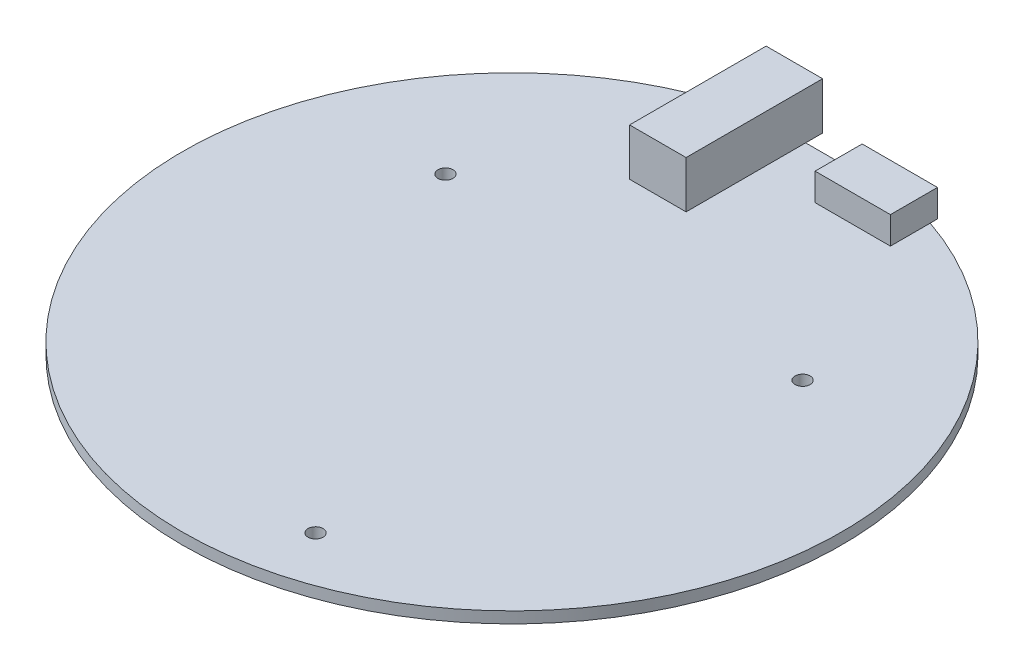
ISO-10303-21;
HEADER;
FILE_DESCRIPTION(('STEP AP214'),'2;1');
FILE_NAME('part.step','',(''),(''),'','','');
FILE_SCHEMA(('AUTOMOTIVE_DESIGN { 1 0 10303 214 1 1 1 1 }'));
ENDSEC;
DATA;
#1=APPLICATION_CONTEXT('core data for automotive mechanical design processes');
#2=APPLICATION_PROTOCOL_DEFINITION('international standard','automotive_design',2000,#1);
#3=PRODUCT_CONTEXT('',#1,'mechanical');
#4=PRODUCT('Part','Part','',(#3));
#5=PRODUCT_RELATED_PRODUCT_CATEGORY('part','',(#4));
#6=PRODUCT_DEFINITION_FORMATION('','',#4);
#7=PRODUCT_DEFINITION_CONTEXT('part definition',#1,'design');
#8=PRODUCT_DEFINITION('design','',#6,#7);
#9=PRODUCT_DEFINITION_SHAPE('','',#8);
#10=(LENGTH_UNIT() NAMED_UNIT(*) SI_UNIT(.MILLI.,.METRE.));
#11=(NAMED_UNIT(*) PLANE_ANGLE_UNIT() SI_UNIT($,.RADIAN.));
#12=(NAMED_UNIT(*) SI_UNIT($,.STERADIAN.) SOLID_ANGLE_UNIT());
#13=UNCERTAINTY_MEASURE_WITH_UNIT(LENGTH_MEASURE(1.E-05),#10,'distance_accuracy_value','');
#14=(GEOMETRIC_REPRESENTATION_CONTEXT(3) GLOBAL_UNCERTAINTY_ASSIGNED_CONTEXT((#13)) GLOBAL_UNIT_ASSIGNED_CONTEXT((#10,
#11,#12)) REPRESENTATION_CONTEXT('',''));
#15=CARTESIAN_POINT('',(0.,0.,0.));
#16=DIRECTION('',(0.,0.,1.));
#17=DIRECTION('',(1.,0.,0.));
#18=AXIS2_PLACEMENT_3D('',#15,#16,#17);
#19=CARTESIAN_POINT('',(0.,0.,0.));
#20=DIRECTION('',(0.,-1.,0.));
#21=DIRECTION('',(0.,0.,-1.));
#22=AXIS2_PLACEMENT_3D('',#19,#20,#21);
#23=PLANE('',#22);
#24=DIRECTION('',(1.,0.,0.));
#25=VECTOR('',#24,1.);
#26=CARTESIAN_POINT('',(0.,0.,-33.9));
#27=LINE('',#26,#25);
#28=CARTESIAN_POINT('',(-8.70574522944479,0.,-33.9));
#29=VERTEX_POINT('',#28);
#30=CARTESIAN_POINT('',(-2.7057452294448,0.,-33.9));
#31=VERTEX_POINT('',#30);
#32=EDGE_CURVE('E59',#29,#31,#27,.T.);
#33=ORIENTED_EDGE('',*,*,#32,.F.);
#34=DIRECTION('',(0.,0.,1.));
#35=VECTOR('',#34,1.);
#36=CARTESIAN_POINT('',(-8.70574522944479,0.,-33.9));
#37=LINE('',#36,#35);
#38=CARTESIAN_POINT('',(-8.70574522944479,0.,-35.7));
#39=VERTEX_POINT('',#38);
#40=EDGE_CURVE('E198',#39,#29,#37,.T.);
#41=ORIENTED_EDGE('',*,*,#40,.F.);
#42=DIRECTION('',(1.,0.,0.));
#43=VECTOR('',#42,1.);
#44=CARTESIAN_POINT('',(-8.70574522944479,0.,-35.7));
#45=LINE('',#44,#43);
#46=CARTESIAN_POINT('',(-2.7057452294448,0.,-35.7));
#47=VERTEX_POINT('',#46);
#48=EDGE_CURVE('E191',#39,#47,#45,.T.);
#49=ORIENTED_EDGE('',*,*,#48,.T.);
#50=DIRECTION('',(0.,0.,1.));
#51=VECTOR('',#50,1.);
#52=CARTESIAN_POINT('',(-2.7057452294448,0.,-33.9));
#53=LINE('',#52,#51);
#54=EDGE_CURVE('E210',#47,#31,#53,.T.);
#55=ORIENTED_EDGE('',*,*,#54,.T.);
#56=EDGE_LOOP('',(#33,#41,#49,#55));
#57=FACE_BOUND('',#56,.T.);
#58=ADVANCED_FACE('F36',(#57),#23,.T.);
#59=CARTESIAN_POINT('',(-8.70574522944479,5.,-33.9));
#60=DIRECTION('',(1.,0.,0.));
#61=DIRECTION('',(0.,0.,-1.));
#62=AXIS2_PLACEMENT_3D('',#59,#60,#61);
#63=PLANE('',#62);
#64=ORIENTED_EDGE('',*,*,#40,.T.);
#65=CARTESIAN_POINT('',(-8.70574522944479,0.,-21.2));
#66=VERTEX_POINT('',#65);
#67=EDGE_CURVE('E215',#29,#66,#37,.T.);
#68=ORIENTED_EDGE('',*,*,#67,.T.);
#69=DIRECTION('',(0.,-1.,0.));
#70=VECTOR('',#69,1.);
#71=CARTESIAN_POINT('',(-8.70574522944479,5.,-21.2));
#72=LINE('',#71,#70);
#73=CARTESIAN_POINT('',(-8.70574522944479,5.,-21.2));
#74=VERTEX_POINT('',#73);
#75=EDGE_CURVE('E44',#74,#66,#72,.T.);
#76=ORIENTED_EDGE('',*,*,#75,.F.);
#77=DIRECTION('',(0.,0.,-1.));
#78=VECTOR('',#77,1.);
#79=CARTESIAN_POINT('',(-8.70574522944479,5.,-33.9));
#80=LINE('',#79,#78);
#81=CARTESIAN_POINT('',(-8.70574522944479,5.,-35.7));
#82=VERTEX_POINT('',#81);
#83=EDGE_CURVE('E194',#74,#82,#80,.T.);
#84=ORIENTED_EDGE('',*,*,#83,.T.);
#85=DIRECTION('',(0.,-1.,0.));
#86=VECTOR('',#85,1.);
#87=CARTESIAN_POINT('',(-8.70574522944479,5.,-35.7));
#88=LINE('',#87,#86);
#89=EDGE_CURVE('E206',#82,#39,#88,.T.);
#90=ORIENTED_EDGE('',*,*,#89,.T.);
#91=EDGE_LOOP('',(#64,#68,#76,#84,#90));
#92=FACE_BOUND('',#91,.T.);
#93=ADVANCED_FACE('F226',(#92),#63,.F.);
#94=CARTESIAN_POINT('',(-8.70574522944479,5.,-21.2));
#95=DIRECTION('',(0.,0.,-1.));
#96=DIRECTION('',(-1.,0.,0.));
#97=AXIS2_PLACEMENT_3D('',#94,#95,#96);
#98=PLANE('',#97);
#99=DIRECTION('',(1.,0.,0.));
#100=VECTOR('',#99,1.);
#101=CARTESIAN_POINT('',(-8.70574522944479,0.,-21.2));
#102=LINE('',#101,#100);
#103=CARTESIAN_POINT('',(-2.7057452294448,0.,-21.2));
#104=VERTEX_POINT('',#103);
#105=EDGE_CURVE('E212',#66,#104,#102,.T.);
#106=ORIENTED_EDGE('',*,*,#105,.T.);
#107=DIRECTION('',(0.,-1.,0.));
#108=VECTOR('',#107,1.);
#109=CARTESIAN_POINT('',(-2.7057452294448,5.,-21.2));
#110=LINE('',#109,#108);
#111=CARTESIAN_POINT('',(-2.7057452294448,5.,-21.2));
#112=VERTEX_POINT('',#111);
#113=EDGE_CURVE('E219',#112,#104,#110,.T.);
#114=ORIENTED_EDGE('',*,*,#113,.F.);
#115=DIRECTION('',(1.,0.,0.));
#116=VECTOR('',#115,1.);
#117=CARTESIAN_POINT('',(-8.70574522944479,5.,-21.2));
#118=LINE('',#117,#116);
#119=EDGE_CURVE('E203',#74,#112,#118,.T.);
#120=ORIENTED_EDGE('',*,*,#119,.F.);
#121=ORIENTED_EDGE('',*,*,#75,.T.);
#122=EDGE_LOOP('',(#106,#114,#120,#121));
#123=FACE_BOUND('',#122,.T.);
#124=ADVANCED_FACE('F253',(#123),#98,.F.);
#125=CARTESIAN_POINT('',(-2.7057452294448,5.,-33.9));
#126=DIRECTION('',(1.,0.,0.));
#127=DIRECTION('',(0.,0.,-1.));
#128=AXIS2_PLACEMENT_3D('',#125,#126,#127);
#129=PLANE('',#128);
#130=ORIENTED_EDGE('',*,*,#54,.F.);
#131=DIRECTION('',(0.,-1.,0.));
#132=VECTOR('',#131,1.);
#133=CARTESIAN_POINT('',(-2.7057452294448,5.,-35.7));
#134=LINE('',#133,#132);
#135=CARTESIAN_POINT('',(-2.7057452294448,5.,-35.7));
#136=VERTEX_POINT('',#135);
#137=EDGE_CURVE('E221',#136,#47,#134,.T.);
#138=ORIENTED_EDGE('',*,*,#137,.F.);
#139=DIRECTION('',(0.,0.,1.));
#140=VECTOR('',#139,1.);
#141=CARTESIAN_POINT('',(-2.7057452294448,5.,-35.7));
#142=LINE('',#141,#140);
#143=EDGE_CURVE('E201',#136,#112,#142,.T.);
#144=ORIENTED_EDGE('',*,*,#143,.T.);
#145=ORIENTED_EDGE('',*,*,#113,.T.);
#146=EDGE_CURVE('E209',#31,#104,#53,.T.);
#147=ORIENTED_EDGE('',*,*,#146,.F.);
#148=EDGE_LOOP('',(#130,#138,#144,#145,#147));
#149=FACE_BOUND('',#148,.T.);
#150=ADVANCED_FACE('F235',(#149),#129,.T.);
#151=CARTESIAN_POINT('',(-8.70574522944479,5.,-35.7));
#152=DIRECTION('',(0.,0.,-1.));
#153=DIRECTION('',(-1.,0.,0.));
#154=AXIS2_PLACEMENT_3D('',#151,#152,#153);
#155=PLANE('',#154);
#156=ORIENTED_EDGE('',*,*,#48,.F.);
#157=ORIENTED_EDGE('',*,*,#89,.F.);
#158=DIRECTION('',(1.,0.,0.));
#159=VECTOR('',#158,1.);
#160=CARTESIAN_POINT('',(-8.70574522944479,5.,-35.7));
#161=LINE('',#160,#159);
#162=EDGE_CURVE('E197',#82,#136,#161,.T.);
#163=ORIENTED_EDGE('',*,*,#162,.T.);
#164=ORIENTED_EDGE('',*,*,#137,.T.);
#165=EDGE_LOOP('',(#156,#157,#163,#164));
#166=FACE_BOUND('',#165,.T.);
#167=ADVANCED_FACE('F38',(#166),#155,.T.);
#168=CARTESIAN_POINT('',(0.,5.,0.));
#169=DIRECTION('',(0.,-1.,0.));
#170=DIRECTION('',(0.,0.,-1.));
#171=AXIS2_PLACEMENT_3D('',#168,#169,#170);
#172=PLANE('',#171);
#173=ORIENTED_EDGE('',*,*,#83,.F.);
#174=ORIENTED_EDGE('',*,*,#119,.T.);
#175=ORIENTED_EDGE('',*,*,#143,.F.);
#176=ORIENTED_EDGE('',*,*,#162,.F.);
#177=EDGE_LOOP('',(#173,#174,#175,#176));
#178=FACE_BOUND('',#177,.T.);
#179=ADVANCED_FACE('F256',(#178),#172,.F.);
#180=CARTESIAN_POINT('',(0.,-1.2,-33.9));
#181=DIRECTION('',(0.,0.,1.));
#182=DIRECTION('',(1.,0.,0.));
#183=AXIS2_PLACEMENT_3D('',#180,#181,#182);
#184=PLANE('',#183);
#185=ORIENTED_EDGE('',*,*,#32,.T.);
#186=CARTESIAN_POINT('',(3.2942547705552,0.,-33.9));
#187=VERTEX_POINT('',#186);
#188=EDGE_CURVE('E177',#31,#187,#27,.T.);
#189=ORIENTED_EDGE('',*,*,#188,.T.);
#190=DIRECTION('',(0.,-1.,0.));
#191=VECTOR('',#190,1.);
#192=CARTESIAN_POINT('',(3.2942547705552,2.9,-33.9));
#193=LINE('',#192,#191);
#194=CARTESIAN_POINT('',(3.2942547705552,2.9,-33.9));
#195=VERTEX_POINT('',#194);
#196=EDGE_CURVE('E131',#195,#187,#193,.T.);
#197=ORIENTED_EDGE('',*,*,#196,.F.);
#198=DIRECTION('',(1.,0.,0.));
#199=VECTOR('',#198,1.);
#200=CARTESIAN_POINT('',(0.,2.9,-33.9));
#201=LINE('',#200,#199);
#202=CARTESIAN_POINT('',(11.2942547705552,2.9,-33.9));
#203=VERTEX_POINT('',#202);
#204=EDGE_CURVE('E136',#195,#203,#201,.T.);
#205=ORIENTED_EDGE('',*,*,#204,.T.);
#206=DIRECTION('',(0.,-1.,0.));
#207=VECTOR('',#206,1.);
#208=CARTESIAN_POINT('',(11.2942547705552,2.9,-33.9));
#209=LINE('',#208,#207);
#210=CARTESIAN_POINT('',(11.2942547705552,0.,-33.9));
#211=VERTEX_POINT('',#210);
#212=EDGE_CURVE('E121',#203,#211,#209,.T.);
#213=ORIENTED_EDGE('',*,*,#212,.T.);
#214=DIRECTION('',(1.,0.,0.));
#215=VECTOR('',#214,1.);
#216=CARTESIAN_POINT('',(0.,0.,-33.9));
#217=LINE('',#216,#215);
#218=CARTESIAN_POINT('',(8.70574522944479,0.,-33.9));
#219=VERTEX_POINT('',#218);
#220=EDGE_CURVE('E151',#219,#211,#217,.T.);
#221=ORIENTED_EDGE('',*,*,#220,.F.);
#222=DIRECTION('',(0.,1.,0.));
#223=VECTOR('',#222,1.);
#224=CARTESIAN_POINT('',(8.70574522944479,-1.2,-33.9));
#225=LINE('',#224,#223);
#226=CARTESIAN_POINT('',(8.70574522944479,-1.2,-33.9));
#227=VERTEX_POINT('',#226);
#228=EDGE_CURVE('E188',#227,#219,#225,.T.);
#229=ORIENTED_EDGE('',*,*,#228,.F.);
#230=DIRECTION('',(1.,0.,0.));
#231=VECTOR('',#230,1.);
#232=CARTESIAN_POINT('',(0.,-1.2,-33.9));
#233=LINE('',#232,#231);
#234=CARTESIAN_POINT('',(-8.70574522944479,-1.2,-33.9));
#235=VERTEX_POINT('',#234);
#236=EDGE_CURVE('E162',#235,#227,#233,.T.);
#237=ORIENTED_EDGE('',*,*,#236,.F.);
#238=DIRECTION('',(0.,1.,0.));
#239=VECTOR('',#238,1.);
#240=CARTESIAN_POINT('',(-8.70574522944479,-1.2,-33.9));
#241=LINE('',#240,#239);
#242=EDGE_CURVE('E174',#235,#29,#241,.T.);
#243=ORIENTED_EDGE('',*,*,#242,.T.);
#244=EDGE_LOOP('',(#185,#189,#197,#205,#213,#221,#229,#237,#243));
#245=FACE_BOUND('',#244,.T.);
#246=ADVANCED_FACE('F141',(#245),#184,.F.);
#247=CARTESIAN_POINT('',(18.9637578193218,-1.2,-11.9));
#248=DIRECTION('',(0.,1.,0.));
#249=DIRECTION('',(0.,0.,1.));
#250=AXIS2_PLACEMENT_3D('',#247,#248,#249);
#251=CYLINDRICAL_SURFACE('',#250,0.799999999999999);
#252=CARTESIAN_POINT('',(18.9637578193218,-1.2,-11.9));
#253=DIRECTION('',(0.,1.,0.));
#254=DIRECTION('',(0.,0.,1.));
#255=AXIS2_PLACEMENT_3D('',#252,#253,#254);
#256=CIRCLE('',#255,0.799999999999999);
#257=CARTESIAN_POINT('',(18.9637578193218,-1.2,-11.1));
#258=VERTEX_POINT('',#257);
#259=EDGE_CURVE('E168',#258,#258,#256,.T.);
#260=ORIENTED_EDGE('',*,*,#259,.F.);
#261=EDGE_LOOP('',(#260));
#262=FACE_BOUND('',#261,.T.);
#263=CARTESIAN_POINT('',(18.9637578193218,0.,-11.9));
#264=DIRECTION('',(0.,1.,0.));
#265=DIRECTION('',(0.,0.,1.));
#266=AXIS2_PLACEMENT_3D('',#263,#264,#265);
#267=CIRCLE('',#266,0.799999999999999);
#268=CARTESIAN_POINT('',(18.9637578193218,0.,-11.1));
#269=VERTEX_POINT('',#268);
#270=EDGE_CURVE('E183',#269,#269,#267,.T.);
#271=ORIENTED_EDGE('',*,*,#270,.T.);
#272=EDGE_LOOP('',(#271));
#273=FACE_BOUND('',#272,.T.);
#274=ADVANCED_FACE('F263',(#262,#273),#251,.F.);
#275=CARTESIAN_POINT('',(0.,-1.2,0.));
#276=DIRECTION('',(0.,1.,0.));
#277=DIRECTION('',(0.,0.,1.));
#278=AXIS2_PLACEMENT_3D('',#275,#276,#277);
#279=CYLINDRICAL_SURFACE('',#278,35.);
#280=CARTESIAN_POINT('',(0.,0.,0.));
#281=DIRECTION('',(0.,1.,0.));
#282=DIRECTION('',(0.,0.,1.));
#283=AXIS2_PLACEMENT_3D('',#280,#281,#282);
#284=CIRCLE('',#283,35.);
#285=CARTESIAN_POINT('',(11.2942547705552,0.,-33.1276290908026));
#286=VERTEX_POINT('',#285);
#287=EDGE_CURVE('E180',#29,#286,#284,.T.);
#288=ORIENTED_EDGE('',*,*,#287,.F.);
#289=ORIENTED_EDGE('',*,*,#242,.F.);
#290=CARTESIAN_POINT('',(0.,-1.2,0.));
#291=DIRECTION('',(0.,1.,0.));
#292=DIRECTION('',(0.,0.,1.));
#293=AXIS2_PLACEMENT_3D('',#290,#291,#292);
#294=CIRCLE('',#293,35.);
#295=EDGE_CURVE('E165',#235,#227,#294,.T.);
#296=ORIENTED_EDGE('',*,*,#295,.T.);
#297=ORIENTED_EDGE('',*,*,#228,.T.);
#298=EDGE_CURVE('E179',#286,#219,#284,.T.);
#299=ORIENTED_EDGE('',*,*,#298,.F.);
#300=EDGE_LOOP('',(#288,#289,#296,#297,#299));
#301=FACE_BOUND('',#300,.T.);
#302=ADVANCED_FACE('F250',(#301),#279,.T.);
#303=CARTESIAN_POINT('',(7.14,-1.2,28.));
#304=DIRECTION('',(0.,1.,0.));
#305=DIRECTION('',(0.,0.,1.));
#306=AXIS2_PLACEMENT_3D('',#303,#304,#305);
#307=CYLINDRICAL_SURFACE('',#306,0.8);
#308=CARTESIAN_POINT('',(7.14,-1.2,28.));
#309=DIRECTION('',(0.,1.,0.));
#310=DIRECTION('',(0.,0.,1.));
#311=AXIS2_PLACEMENT_3D('',#308,#309,#310);
#312=CIRCLE('',#311,0.8);
#313=CARTESIAN_POINT('',(7.14,-1.2,28.8));
#314=VERTEX_POINT('',#313);
#315=EDGE_CURVE('E159',#314,#314,#312,.T.);
#316=ORIENTED_EDGE('',*,*,#315,.F.);
#317=EDGE_LOOP('',(#316));
#318=FACE_BOUND('',#317,.T.);
#319=CARTESIAN_POINT('',(7.14,0.,28.));
#320=DIRECTION('',(0.,1.,0.));
#321=DIRECTION('',(0.,0.,1.));
#322=AXIS2_PLACEMENT_3D('',#319,#320,#321);
#323=CIRCLE('',#322,0.8);
#324=CARTESIAN_POINT('',(7.14,0.,28.8));
#325=VERTEX_POINT('',#324);
#326=EDGE_CURVE('E130',#325,#325,#323,.T.);
#327=ORIENTED_EDGE('',*,*,#326,.T.);
#328=EDGE_LOOP('',(#327));
#329=FACE_BOUND('',#328,.T.);
#330=ADVANCED_FACE('F297',(#318,#329),#307,.F.);
#331=CARTESIAN_POINT('',(-18.9637578193218,-1.2,-11.9));
#332=DIRECTION('',(0.,1.,0.));
#333=DIRECTION('',(0.,0.,1.));
#334=AXIS2_PLACEMENT_3D('',#331,#332,#333);
#335=CYLINDRICAL_SURFACE('',#334,0.799999999999999);
#336=CARTESIAN_POINT('',(-18.9637578193218,-1.2,-11.9));
#337=DIRECTION('',(0.,1.,0.));
#338=DIRECTION('',(0.,0.,1.));
#339=AXIS2_PLACEMENT_3D('',#336,#337,#338);
#340=CIRCLE('',#339,0.799999999999999);
#341=CARTESIAN_POINT('',(-18.9637578193218,-1.2,-11.1));
#342=VERTEX_POINT('',#341);
#343=EDGE_CURVE('E171',#342,#342,#340,.F.);
#344=ORIENTED_EDGE('',*,*,#343,.T.);
#345=EDGE_LOOP('',(#344));
#346=FACE_BOUND('',#345,.T.);
#347=CARTESIAN_POINT('',(-18.9637578193218,0.,-11.9));
#348=DIRECTION('',(0.,1.,0.));
#349=DIRECTION('',(0.,0.,1.));
#350=AXIS2_PLACEMENT_3D('',#347,#348,#349);
#351=CIRCLE('',#350,0.799999999999999);
#352=CARTESIAN_POINT('',(-18.9637578193218,0.,-11.1));
#353=VERTEX_POINT('',#352);
#354=EDGE_CURVE('E163',#353,#353,#351,.F.);
#355=ORIENTED_EDGE('',*,*,#354,.F.);
#356=EDGE_LOOP('',(#355));
#357=FACE_BOUND('',#356,.T.);
#358=ADVANCED_FACE('F302',(#346,#357),#335,.F.);
#359=CARTESIAN_POINT('',(0.,-1.2,0.));
#360=DIRECTION('',(0.,1.,0.));
#361=DIRECTION('',(0.,0.,1.));
#362=AXIS2_PLACEMENT_3D('',#359,#360,#361);
#363=PLANE('',#362);
#364=ORIENTED_EDGE('',*,*,#315,.T.);
#365=EDGE_LOOP('',(#364));
#366=FACE_BOUND('',#365,.T.);
#367=ORIENTED_EDGE('',*,*,#236,.T.);
#368=ORIENTED_EDGE('',*,*,#295,.F.);
#369=EDGE_LOOP('',(#367,#368));
#370=FACE_BOUND('',#369,.T.);
#371=ORIENTED_EDGE('',*,*,#259,.T.);
#372=EDGE_LOOP('',(#371));
#373=FACE_BOUND('',#372,.T.);
#374=ORIENTED_EDGE('',*,*,#343,.F.);
#375=EDGE_LOOP('',(#374));
#376=FACE_BOUND('',#375,.T.);
#377=ADVANCED_FACE('F320',(#366,#370,#373,#376),#363,.F.);
#378=CARTESIAN_POINT('',(0.,0.,0.));
#379=DIRECTION('',(0.,1.,0.));
#380=DIRECTION('',(0.,0.,1.));
#381=AXIS2_PLACEMENT_3D('',#378,#379,#380);
#382=PLANE('',#381);
#383=DIRECTION('',(0.,0.,-1.));
#384=VECTOR('',#383,1.);
#385=CARTESIAN_POINT('',(11.2942547705552,0.,0.));
#386=LINE('',#385,#384);
#387=CARTESIAN_POINT('',(11.2942547705552,0.,-28.9));
#388=VERTEX_POINT('',#387);
#389=EDGE_CURVE('E11',#388,#286,#386,.T.);
#390=ORIENTED_EDGE('',*,*,#389,.F.);
#391=DIRECTION('',(1.,0.,0.));
#392=VECTOR('',#391,1.);
#393=CARTESIAN_POINT('',(0.,0.,-28.9));
#394=LINE('',#393,#392);
#395=CARTESIAN_POINT('',(3.2942547705552,0.,-28.9));
#396=VERTEX_POINT('',#395);
#397=EDGE_CURVE('E139',#396,#388,#394,.T.);
#398=ORIENTED_EDGE('',*,*,#397,.F.);
#399=DIRECTION('',(0.,0.,1.));
#400=VECTOR('',#399,1.);
#401=CARTESIAN_POINT('',(3.2942547705552,0.,0.));
#402=LINE('',#401,#400);
#403=EDGE_CURVE('E153',#187,#396,#402,.T.);
#404=ORIENTED_EDGE('',*,*,#403,.F.);
#405=ORIENTED_EDGE('',*,*,#188,.F.);
#406=ORIENTED_EDGE('',*,*,#146,.T.);
#407=ORIENTED_EDGE('',*,*,#105,.F.);
#408=ORIENTED_EDGE('',*,*,#67,.F.);
#409=ORIENTED_EDGE('',*,*,#287,.T.);
#410=EDGE_LOOP('',(#390,#398,#404,#405,#406,#407,#408,#409));
#411=FACE_BOUND('',#410,.T.);
#412=ORIENTED_EDGE('',*,*,#326,.F.);
#413=EDGE_LOOP('',(#412));
#414=FACE_BOUND('',#413,.T.);
#415=ORIENTED_EDGE('',*,*,#270,.F.);
#416=EDGE_LOOP('',(#415));
#417=FACE_BOUND('',#416,.T.);
#418=ORIENTED_EDGE('',*,*,#354,.T.);
#419=EDGE_LOOP('',(#418));
#420=FACE_BOUND('',#419,.T.);
#421=ADVANCED_FACE('F241',(#411,#414,#417,#420),#382,.T.);
#422=CARTESIAN_POINT('',(11.2942547705552,2.9,0.));
#423=DIRECTION('',(1.,0.,0.));
#424=DIRECTION('',(0.,0.,-1.));
#425=AXIS2_PLACEMENT_3D('',#422,#423,#424);
#426=PLANE('',#425);
#427=DIRECTION('',(0.,0.,1.));
#428=VECTOR('',#427,1.);
#429=CARTESIAN_POINT('',(11.2942547705552,0.,0.));
#430=LINE('',#429,#428);
#431=EDGE_CURVE('E126',#211,#286,#430,.T.);
#432=ORIENTED_EDGE('',*,*,#431,.F.);
#433=ORIENTED_EDGE('',*,*,#212,.F.);
#434=DIRECTION('',(0.,0.,1.));
#435=VECTOR('',#434,1.);
#436=CARTESIAN_POINT('',(11.2942547705552,2.9,0.));
#437=LINE('',#436,#435);
#438=CARTESIAN_POINT('',(11.2942547705552,2.9,-28.9));
#439=VERTEX_POINT('',#438);
#440=EDGE_CURVE('E124',#203,#439,#437,.T.);
#441=ORIENTED_EDGE('',*,*,#440,.T.);
#442=DIRECTION('',(0.,-1.,0.));
#443=VECTOR('',#442,1.);
#444=CARTESIAN_POINT('',(11.2942547705552,2.9,-28.9));
#445=LINE('',#444,#443);
#446=EDGE_CURVE('E149',#439,#388,#445,.T.);
#447=ORIENTED_EDGE('',*,*,#446,.T.);
#448=ORIENTED_EDGE('',*,*,#389,.T.);
#449=EDGE_LOOP('',(#432,#433,#441,#447,#448));
#450=FACE_BOUND('',#449,.T.);
#451=ADVANCED_FACE('F123',(#450),#426,.T.);
#452=CARTESIAN_POINT('',(3.2942547705552,2.9,0.));
#453=DIRECTION('',(1.,0.,0.));
#454=DIRECTION('',(0.,0.,-1.));
#455=AXIS2_PLACEMENT_3D('',#452,#453,#454);
#456=PLANE('',#455);
#457=ORIENTED_EDGE('',*,*,#403,.T.);
#458=DIRECTION('',(0.,-1.,0.));
#459=VECTOR('',#458,1.);
#460=CARTESIAN_POINT('',(3.2942547705552,2.9,-28.9));
#461=LINE('',#460,#459);
#462=CARTESIAN_POINT('',(3.2942547705552,2.9,-28.9));
#463=VERTEX_POINT('',#462);
#464=EDGE_CURVE('E51',#463,#396,#461,.T.);
#465=ORIENTED_EDGE('',*,*,#464,.F.);
#466=DIRECTION('',(0.,0.,1.));
#467=VECTOR('',#466,1.);
#468=CARTESIAN_POINT('',(3.2942547705552,2.9,0.));
#469=LINE('',#468,#467);
#470=EDGE_CURVE('E144',#195,#463,#469,.T.);
#471=ORIENTED_EDGE('',*,*,#470,.F.);
#472=ORIENTED_EDGE('',*,*,#196,.T.);
#473=EDGE_LOOP('',(#457,#465,#471,#472));
#474=FACE_BOUND('',#473,.T.);
#475=ADVANCED_FACE('F355',(#474),#456,.F.);
#476=CARTESIAN_POINT('',(0.,2.9,-28.9));
#477=DIRECTION('',(0.,0.,-1.));
#478=DIRECTION('',(-1.,0.,0.));
#479=AXIS2_PLACEMENT_3D('',#476,#477,#478);
#480=PLANE('',#479);
#481=ORIENTED_EDGE('',*,*,#397,.T.);
#482=ORIENTED_EDGE('',*,*,#446,.F.);
#483=DIRECTION('',(1.,0.,0.));
#484=VECTOR('',#483,1.);
#485=CARTESIAN_POINT('',(0.,2.9,-28.9));
#486=LINE('',#485,#484);
#487=EDGE_CURVE('E137',#463,#439,#486,.T.);
#488=ORIENTED_EDGE('',*,*,#487,.F.);
#489=ORIENTED_EDGE('',*,*,#464,.T.);
#490=EDGE_LOOP('',(#481,#482,#488,#489));
#491=FACE_BOUND('',#490,.T.);
#492=ADVANCED_FACE('F350',(#491),#480,.F.);
#493=CARTESIAN_POINT('',(0.,2.9,0.));
#494=DIRECTION('',(0.,1.,0.));
#495=DIRECTION('',(0.,0.,1.));
#496=AXIS2_PLACEMENT_3D('',#493,#494,#495);
#497=PLANE('',#496);
#498=ORIENTED_EDGE('',*,*,#440,.F.);
#499=ORIENTED_EDGE('',*,*,#204,.F.);
#500=ORIENTED_EDGE('',*,*,#470,.T.);
#501=ORIENTED_EDGE('',*,*,#487,.T.);
#502=EDGE_LOOP('',(#498,#499,#500,#501));
#503=FACE_BOUND('',#502,.T.);
#504=ADVANCED_FACE('F135',(#503),#497,.T.);
#505=CARTESIAN_POINT('',(0.,0.,0.));
#506=DIRECTION('',(0.,1.,0.));
#507=DIRECTION('',(0.,0.,1.));
#508=AXIS2_PLACEMENT_3D('',#505,#506,#507);
#509=PLANE('',#508);
#510=ORIENTED_EDGE('',*,*,#298,.T.);
#511=ORIENTED_EDGE('',*,*,#220,.T.);
#512=ORIENTED_EDGE('',*,*,#431,.T.);
#513=EDGE_LOOP('',(#510,#511,#512));
#514=FACE_BOUND('',#513,.T.);
#515=ADVANCED_FACE('F372',(#514),#509,.F.);
#516=CLOSED_SHELL('',(#58,#93,#124,#150,#167,#179,#246,#274,#302,#330,#358,#377,#421,#451,#475,
#492,#504,#515));
#517=MANIFOLD_SOLID_BREP('B2',#516);
#518=ADVANCED_BREP_SHAPE_REPRESENTATION('',(#18,#517),#14);
#519=SHAPE_DEFINITION_REPRESENTATION(#9,#518);
ENDSEC;
END-ISO-10303-21;
